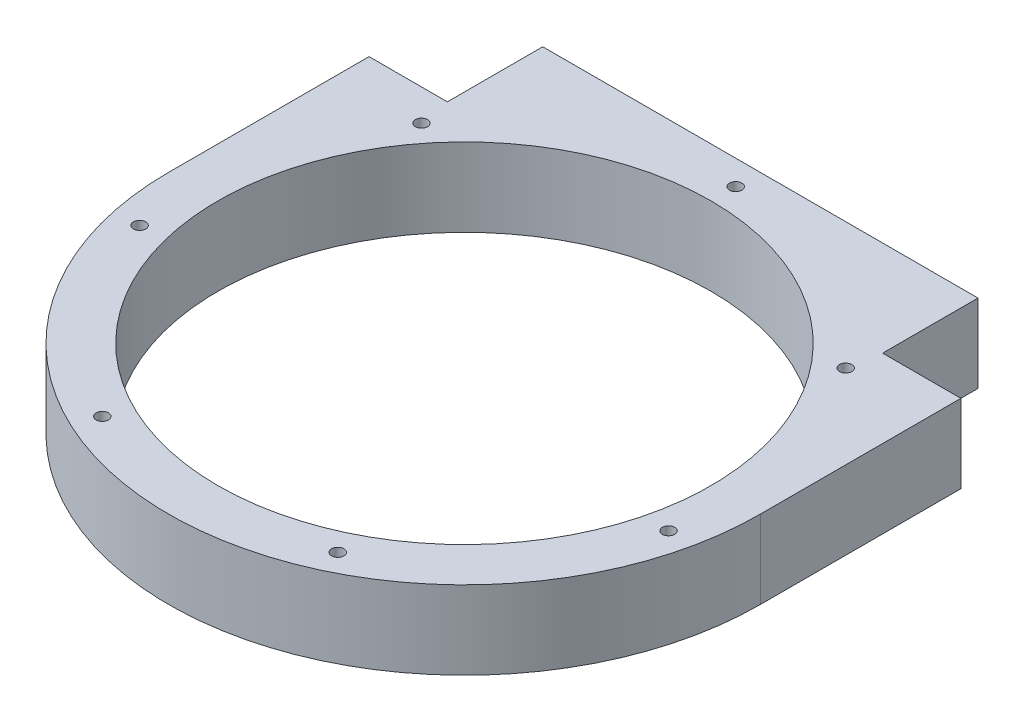
ISO-10303-21;
HEADER;
FILE_DESCRIPTION(('STEP AP214'),'2;1');
FILE_NAME('part.step','',(''),(''),'','','');
FILE_SCHEMA(('AUTOMOTIVE_DESIGN { 1 0 10303 214 1 1 1 1 }'));
ENDSEC;
DATA;
#1=APPLICATION_CONTEXT('core data for automotive mechanical design processes');
#2=APPLICATION_PROTOCOL_DEFINITION('international standard','automotive_design',2000,#1);
#3=PRODUCT_CONTEXT('',#1,'mechanical');
#4=PRODUCT('Part','Part','',(#3));
#5=PRODUCT_RELATED_PRODUCT_CATEGORY('part','',(#4));
#6=PRODUCT_DEFINITION_FORMATION('','',#4);
#7=PRODUCT_DEFINITION_CONTEXT('part definition',#1,'design');
#8=PRODUCT_DEFINITION('design','',#6,#7);
#9=PRODUCT_DEFINITION_SHAPE('','',#8);
#10=(LENGTH_UNIT() NAMED_UNIT(*) SI_UNIT(.MILLI.,.METRE.));
#11=(NAMED_UNIT(*) PLANE_ANGLE_UNIT() SI_UNIT($,.RADIAN.));
#12=(NAMED_UNIT(*) SI_UNIT($,.STERADIAN.) SOLID_ANGLE_UNIT());
#13=UNCERTAINTY_MEASURE_WITH_UNIT(LENGTH_MEASURE(1.E-05),#10,'distance_accuracy_value','');
#14=(GEOMETRIC_REPRESENTATION_CONTEXT(3) GLOBAL_UNCERTAINTY_ASSIGNED_CONTEXT((#13)) GLOBAL_UNIT_ASSIGNED_CONTEXT((#10,
#11,#12)) REPRESENTATION_CONTEXT('',''));
#15=CARTESIAN_POINT('',(0.,0.,0.));
#16=DIRECTION('',(0.,0.,1.));
#17=DIRECTION('',(1.,0.,0.));
#18=AXIS2_PLACEMENT_3D('',#15,#16,#17);
#19=CARTESIAN_POINT('',(0.,12.7,-48.));
#20=DIRECTION('',(0.,0.,1.));
#21=DIRECTION('',(1.,0.,0.));
#22=AXIS2_PLACEMENT_3D('',#19,#20,#21);
#23=PLANE('',#22);
#24=DIRECTION('',(-1.,0.,0.));
#25=VECTOR('',#24,1.);
#26=CARTESIAN_POINT('',(0.,0.,-48.));
#27=LINE('',#26,#25);
#28=CARTESIAN_POINT('',(35.3,0.,-48.));
#29=VERTEX_POINT('',#28);
#30=CARTESIAN_POINT('',(-35.3,0.,-48.));
#31=VERTEX_POINT('',#30);
#32=EDGE_CURVE('E161',#29,#31,#27,.T.);
#33=ORIENTED_EDGE('',*,*,#32,.T.);
#34=DIRECTION('',(0.,-1.,0.));
#35=VECTOR('',#34,1.);
#36=CARTESIAN_POINT('',(-35.3,12.7,-48.));
#37=LINE('',#36,#35);
#38=CARTESIAN_POINT('',(-35.3,12.7,-48.));
#39=VERTEX_POINT('',#38);
#40=EDGE_CURVE('E11',#39,#31,#37,.T.);
#41=ORIENTED_EDGE('',*,*,#40,.F.);
#42=DIRECTION('',(-1.,0.,0.));
#43=VECTOR('',#42,1.);
#44=CARTESIAN_POINT('',(0.,12.7,-48.));
#45=LINE('',#44,#43);
#46=CARTESIAN_POINT('',(35.3,12.7,-48.));
#47=VERTEX_POINT('',#46);
#48=EDGE_CURVE('E229',#47,#39,#45,.T.);
#49=ORIENTED_EDGE('',*,*,#48,.F.);
#50=DIRECTION('',(0.,-1.,0.));
#51=VECTOR('',#50,1.);
#52=CARTESIAN_POINT('',(35.3,12.7,-48.));
#53=LINE('',#52,#51);
#54=EDGE_CURVE('E157',#47,#29,#53,.T.);
#55=ORIENTED_EDGE('',*,*,#54,.T.);
#56=EDGE_LOOP('',(#33,#41,#49,#55));
#57=FACE_BOUND('',#56,.T.);
#58=ADVANCED_FACE('F39',(#57),#23,.F.);
#59=CARTESIAN_POINT('',(-35.3,12.7,0.));
#60=DIRECTION('',(1.,0.,0.));
#61=DIRECTION('',(0.,0.,-1.));
#62=AXIS2_PLACEMENT_3D('',#59,#60,#61);
#63=PLANE('',#62);
#64=DIRECTION('',(0.,0.,1.));
#65=VECTOR('',#64,1.);
#66=CARTESIAN_POINT('',(-35.3,0.,0.));
#67=LINE('',#66,#65);
#68=CARTESIAN_POINT('',(-35.3,0.,-32.525528435369));
#69=VERTEX_POINT('',#68);
#70=EDGE_CURVE('E164',#31,#69,#67,.T.);
#71=ORIENTED_EDGE('',*,*,#70,.T.);
#72=DIRECTION('',(0.,-1.,0.));
#73=VECTOR('',#72,1.);
#74=CARTESIAN_POINT('',(-35.3,12.7,-32.525528435369));
#75=LINE('',#74,#73);
#76=CARTESIAN_POINT('',(-35.3,12.7,-32.525528435369));
#77=VERTEX_POINT('',#76);
#78=EDGE_CURVE('E48',#77,#69,#75,.T.);
#79=ORIENTED_EDGE('',*,*,#78,.F.);
#80=DIRECTION('',(0.,0.,1.));
#81=VECTOR('',#80,1.);
#82=CARTESIAN_POINT('',(-35.3,12.7,0.));
#83=LINE('',#82,#81);
#84=EDGE_CURVE('E99',#39,#77,#83,.T.);
#85=ORIENTED_EDGE('',*,*,#84,.F.);
#86=ORIENTED_EDGE('',*,*,#40,.T.);
#87=EDGE_LOOP('',(#71,#79,#85,#86));
#88=FACE_BOUND('',#87,.T.);
#89=ADVANCED_FACE('F248',(#88),#63,.F.);
#90=CARTESIAN_POINT('',(0.,12.7,-32.5255284353691));
#91=DIRECTION('',(0.,0.,1.));
#92=DIRECTION('',(1.,0.,0.));
#93=AXIS2_PLACEMENT_3D('',#90,#91,#92);
#94=PLANE('',#93);
#95=DIRECTION('',(-1.,0.,0.));
#96=VECTOR('',#95,1.);
#97=CARTESIAN_POINT('',(0.,0.,-32.5255284353691));
#98=LINE('',#97,#96);
#99=CARTESIAN_POINT('',(-48.,0.,-32.525528435369));
#100=VERTEX_POINT('',#99);
#101=EDGE_CURVE('E166',#69,#100,#98,.T.);
#102=ORIENTED_EDGE('',*,*,#101,.T.);
#103=DIRECTION('',(0.,-1.,0.));
#104=VECTOR('',#103,1.);
#105=CARTESIAN_POINT('',(-48.,12.7,-32.525528435369));
#106=LINE('',#105,#104);
#107=CARTESIAN_POINT('',(-48.,12.7,-32.525528435369));
#108=VERTEX_POINT('',#107);
#109=EDGE_CURVE('E203',#108,#100,#106,.T.);
#110=ORIENTED_EDGE('',*,*,#109,.F.);
#111=DIRECTION('',(-1.,0.,0.));
#112=VECTOR('',#111,1.);
#113=CARTESIAN_POINT('',(0.,12.7,-32.5255284353691));
#114=LINE('',#113,#112);
#115=EDGE_CURVE('E211',#77,#108,#114,.T.);
#116=ORIENTED_EDGE('',*,*,#115,.F.);
#117=ORIENTED_EDGE('',*,*,#78,.T.);
#118=EDGE_LOOP('',(#102,#110,#116,#117));
#119=FACE_BOUND('',#118,.T.);
#120=ADVANCED_FACE('F209',(#119),#94,.F.);
#121=CARTESIAN_POINT('',(-48.,12.7,0.));
#122=DIRECTION('',(1.,0.,0.));
#123=DIRECTION('',(0.,0.,-1.));
#124=AXIS2_PLACEMENT_3D('',#121,#122,#123);
#125=PLANE('',#124);
#126=DIRECTION('',(0.,0.,1.));
#127=VECTOR('',#126,1.);
#128=CARTESIAN_POINT('',(-48.,0.,0.));
#129=LINE('',#128,#127);
#130=CARTESIAN_POINT('',(-48.,0.,0.));
#131=VERTEX_POINT('',#130);
#132=EDGE_CURVE('E168',#100,#131,#129,.T.);
#133=ORIENTED_EDGE('',*,*,#132,.T.);
#134=DIRECTION('',(0.,-1.,0.));
#135=VECTOR('',#134,1.);
#136=CARTESIAN_POINT('',(-48.,12.7,0.));
#137=LINE('',#136,#135);
#138=CARTESIAN_POINT('',(-48.,12.7,0.));
#139=VERTEX_POINT('',#138);
#140=EDGE_CURVE('E200',#139,#131,#137,.T.);
#141=ORIENTED_EDGE('',*,*,#140,.F.);
#142=DIRECTION('',(0.,0.,1.));
#143=VECTOR('',#142,1.);
#144=CARTESIAN_POINT('',(-48.,12.7,0.));
#145=LINE('',#144,#143);
#146=EDGE_CURVE('E224',#108,#139,#145,.T.);
#147=ORIENTED_EDGE('',*,*,#146,.F.);
#148=ORIENTED_EDGE('',*,*,#109,.T.);
#149=EDGE_LOOP('',(#133,#141,#147,#148));
#150=FACE_BOUND('',#149,.T.);
#151=ADVANCED_FACE('F220',(#150),#125,.F.);
#152=CARTESIAN_POINT('',(0.,12.7,0.));
#153=DIRECTION('',(0.,-1.,0.));
#154=DIRECTION('',(0.,0.,-1.));
#155=AXIS2_PLACEMENT_3D('',#152,#153,#154);
#156=CYLINDRICAL_SURFACE('',#155,48.);
#157=CARTESIAN_POINT('',(0.,0.,0.));
#158=DIRECTION('',(0.,1.,0.));
#159=DIRECTION('',(0.,0.,1.));
#160=AXIS2_PLACEMENT_3D('',#157,#158,#159);
#161=CIRCLE('',#160,48.);
#162=CARTESIAN_POINT('',(48.,0.,0.));
#163=VERTEX_POINT('',#162);
#164=EDGE_CURVE('E170',#131,#163,#161,.T.);
#165=ORIENTED_EDGE('',*,*,#164,.T.);
#166=DIRECTION('',(0.,-1.,0.));
#167=VECTOR('',#166,1.);
#168=CARTESIAN_POINT('',(48.,12.7,0.));
#169=LINE('',#168,#167);
#170=CARTESIAN_POINT('',(48.,12.7,0.));
#171=VERTEX_POINT('',#170);
#172=EDGE_CURVE('E128',#171,#163,#169,.T.);
#173=ORIENTED_EDGE('',*,*,#172,.F.);
#174=CARTESIAN_POINT('',(0.,12.7,0.));
#175=DIRECTION('',(0.,1.,0.));
#176=DIRECTION('',(0.,0.,1.));
#177=AXIS2_PLACEMENT_3D('',#174,#175,#176);
#178=CIRCLE('',#177,48.);
#179=EDGE_CURVE('E119',#139,#171,#178,.T.);
#180=ORIENTED_EDGE('',*,*,#179,.F.);
#181=ORIENTED_EDGE('',*,*,#140,.T.);
#182=EDGE_LOOP('',(#165,#173,#180,#181));
#183=FACE_BOUND('',#182,.T.);
#184=ADVANCED_FACE('F223',(#183),#156,.T.);
#185=CARTESIAN_POINT('',(48.,12.7,0.));
#186=DIRECTION('',(-1.,0.,0.));
#187=DIRECTION('',(0.,0.,1.));
#188=AXIS2_PLACEMENT_3D('',#185,#186,#187);
#189=PLANE('',#188);
#190=DIRECTION('',(0.,0.,-1.));
#191=VECTOR('',#190,1.);
#192=CARTESIAN_POINT('',(48.,0.,0.));
#193=LINE('',#192,#191);
#194=CARTESIAN_POINT('',(48.,0.,-32.525528435369));
#195=VERTEX_POINT('',#194);
#196=EDGE_CURVE('E127',#163,#195,#193,.T.);
#197=ORIENTED_EDGE('',*,*,#196,.T.);
#198=DIRECTION('',(0.,-1.,0.));
#199=VECTOR('',#198,1.);
#200=CARTESIAN_POINT('',(48.,12.7,-32.525528435369));
#201=LINE('',#200,#199);
#202=CARTESIAN_POINT('',(48.,12.7,-32.525528435369));
#203=VERTEX_POINT('',#202);
#204=EDGE_CURVE('E124',#203,#195,#201,.T.);
#205=ORIENTED_EDGE('',*,*,#204,.F.);
#206=DIRECTION('',(0.,0.,-1.));
#207=VECTOR('',#206,1.);
#208=CARTESIAN_POINT('',(48.,12.7,0.));
#209=LINE('',#208,#207);
#210=EDGE_CURVE('E112',#171,#203,#209,.T.);
#211=ORIENTED_EDGE('',*,*,#210,.F.);
#212=ORIENTED_EDGE('',*,*,#172,.T.);
#213=EDGE_LOOP('',(#197,#205,#211,#212));
#214=FACE_BOUND('',#213,.T.);
#215=ADVANCED_FACE('F125',(#214),#189,.F.);
#216=CARTESIAN_POINT('',(0.,12.7,-32.5255284353691));
#217=DIRECTION('',(0.,0.,1.));
#218=DIRECTION('',(1.,0.,0.));
#219=AXIS2_PLACEMENT_3D('',#216,#217,#218);
#220=PLANE('',#219);
#221=DIRECTION('',(-1.,0.,0.));
#222=VECTOR('',#221,1.);
#223=CARTESIAN_POINT('',(0.,0.,-32.5255284353691));
#224=LINE('',#223,#222);
#225=CARTESIAN_POINT('',(35.3,0.,-32.525528435369));
#226=VERTEX_POINT('',#225);
#227=EDGE_CURVE('E85',#195,#226,#224,.T.);
#228=ORIENTED_EDGE('',*,*,#227,.T.);
#229=DIRECTION('',(0.,-1.,0.));
#230=VECTOR('',#229,1.);
#231=CARTESIAN_POINT('',(35.3,12.7,-32.525528435369));
#232=LINE('',#231,#230);
#233=CARTESIAN_POINT('',(35.3,12.7,-32.525528435369));
#234=VERTEX_POINT('',#233);
#235=EDGE_CURVE('E129',#234,#226,#232,.T.);
#236=ORIENTED_EDGE('',*,*,#235,.F.);
#237=DIRECTION('',(-1.,0.,0.));
#238=VECTOR('',#237,1.);
#239=CARTESIAN_POINT('',(0.,12.7,-32.5255284353691));
#240=LINE('',#239,#238);
#241=EDGE_CURVE('E117',#203,#234,#240,.T.);
#242=ORIENTED_EDGE('',*,*,#241,.F.);
#243=ORIENTED_EDGE('',*,*,#204,.T.);
#244=EDGE_LOOP('',(#228,#236,#242,#243));
#245=FACE_BOUND('',#244,.T.);
#246=ADVANCED_FACE('F131',(#245),#220,.F.);
#247=CARTESIAN_POINT('',(19.0908845211726,12.7,39.6426301877064));
#248=DIRECTION('',(0.,-1.,0.));
#249=DIRECTION('',(0.,0.,-1.));
#250=AXIS2_PLACEMENT_3D('',#247,#248,#249);
#251=CYLINDRICAL_SURFACE('',#250,1.);
#252=CARTESIAN_POINT('',(19.0908845211726,12.7,39.6426301877064));
#253=DIRECTION('',(0.,1.,0.));
#254=DIRECTION('',(0.,0.,1.));
#255=AXIS2_PLACEMENT_3D('',#252,#253,#254);
#256=CIRCLE('',#255,1.);
#257=CARTESIAN_POINT('',(19.0908845211726,12.7,40.6426301877064));
#258=VERTEX_POINT('',#257);
#259=EDGE_CURVE('E151',#258,#258,#256,.T.);
#260=ORIENTED_EDGE('',*,*,#259,.T.);
#261=EDGE_LOOP('',(#260));
#262=FACE_BOUND('',#261,.T.);
#263=CARTESIAN_POINT('',(19.0908845211726,0.,39.6426301877064));
#264=DIRECTION('',(0.,1.,0.));
#265=DIRECTION('',(0.,0.,1.));
#266=AXIS2_PLACEMENT_3D('',#263,#264,#265);
#267=CIRCLE('',#266,1.);
#268=CARTESIAN_POINT('',(19.0908845211726,0.,40.6426301877064));
#269=VERTEX_POINT('',#268);
#270=EDGE_CURVE('E190',#269,#269,#267,.T.);
#271=ORIENTED_EDGE('',*,*,#270,.F.);
#272=EDGE_LOOP('',(#271));
#273=FACE_BOUND('',#272,.T.);
#274=ADVANCED_FACE('F265',(#262,#273),#251,.F.);
#275=CARTESIAN_POINT('',(-19.0908845211726,12.7,39.6426301877064));
#276=DIRECTION('',(0.,-1.,0.));
#277=DIRECTION('',(0.,0.,-1.));
#278=AXIS2_PLACEMENT_3D('',#275,#276,#277);
#279=CYLINDRICAL_SURFACE('',#278,1.);
#280=CARTESIAN_POINT('',(-19.0908845211726,12.7,39.6426301877064));
#281=DIRECTION('',(0.,1.,0.));
#282=DIRECTION('',(0.,0.,1.));
#283=AXIS2_PLACEMENT_3D('',#280,#281,#282);
#284=CIRCLE('',#283,1.);
#285=CARTESIAN_POINT('',(-19.0908845211726,12.7,40.6426301877064));
#286=VERTEX_POINT('',#285);
#287=EDGE_CURVE('E148',#286,#286,#284,.T.);
#288=ORIENTED_EDGE('',*,*,#287,.T.);
#289=EDGE_LOOP('',(#288));
#290=FACE_BOUND('',#289,.T.);
#291=CARTESIAN_POINT('',(-19.0908845211726,0.,39.6426301877064));
#292=DIRECTION('',(0.,1.,0.));
#293=DIRECTION('',(0.,0.,1.));
#294=AXIS2_PLACEMENT_3D('',#291,#292,#293);
#295=CIRCLE('',#294,1.);
#296=CARTESIAN_POINT('',(-19.0908845211726,0.,40.6426301877064));
#297=VERTEX_POINT('',#296);
#298=EDGE_CURVE('E187',#297,#297,#295,.T.);
#299=ORIENTED_EDGE('',*,*,#298,.F.);
#300=EDGE_LOOP('',(#299));
#301=FACE_BOUND('',#300,.T.);
#302=ADVANCED_FACE('F284',(#290,#301),#279,.F.);
#303=CARTESIAN_POINT('',(-42.8968281360002,12.7,9.79092109407784));
#304=DIRECTION('',(0.,-1.,0.));
#305=DIRECTION('',(0.,0.,-1.));
#306=AXIS2_PLACEMENT_3D('',#303,#304,#305);
#307=CYLINDRICAL_SURFACE('',#306,0.999999999999998);
#308=CARTESIAN_POINT('',(-42.8968281360002,12.7,9.79092109407784));
#309=DIRECTION('',(0.,1.,0.));
#310=DIRECTION('',(0.,0.,1.));
#311=AXIS2_PLACEMENT_3D('',#308,#309,#310);
#312=CIRCLE('',#311,0.999999999999998);
#313=CARTESIAN_POINT('',(-42.8968281360002,12.7,10.7909210940778));
#314=VERTEX_POINT('',#313);
#315=EDGE_CURVE('E145',#314,#314,#312,.T.);
#316=ORIENTED_EDGE('',*,*,#315,.T.);
#317=EDGE_LOOP('',(#316));
#318=FACE_BOUND('',#317,.T.);
#319=CARTESIAN_POINT('',(-42.8968281360002,0.,9.79092109407784));
#320=DIRECTION('',(0.,1.,0.));
#321=DIRECTION('',(0.,0.,1.));
#322=AXIS2_PLACEMENT_3D('',#319,#320,#321);
#323=CIRCLE('',#322,0.999999999999998);
#324=CARTESIAN_POINT('',(-42.8968281360002,0.,10.7909210940778));
#325=VERTEX_POINT('',#324);
#326=EDGE_CURVE('E184',#325,#325,#323,.T.);
#327=ORIENTED_EDGE('',*,*,#326,.F.);
#328=EDGE_LOOP('',(#327));
#329=FACE_BOUND('',#328,.T.);
#330=ADVANCED_FACE('F280',(#318,#329),#307,.F.);
#331=CARTESIAN_POINT('',(0.,12.7,-44.));
#332=DIRECTION('',(0.,-1.,0.));
#333=DIRECTION('',(0.,0.,-1.));
#334=AXIS2_PLACEMENT_3D('',#331,#332,#333);
#335=CYLINDRICAL_SURFACE('',#334,1.);
#336=CARTESIAN_POINT('',(0.,12.7,-44.));
#337=DIRECTION('',(0.,1.,0.));
#338=DIRECTION('',(0.,0.,1.));
#339=AXIS2_PLACEMENT_3D('',#336,#337,#338);
#340=CIRCLE('',#339,1.);
#341=CARTESIAN_POINT('',(0.,12.7,-43.));
#342=VERTEX_POINT('',#341);
#343=EDGE_CURVE('E142',#342,#342,#340,.T.);
#344=ORIENTED_EDGE('',*,*,#343,.T.);
#345=EDGE_LOOP('',(#344));
#346=FACE_BOUND('',#345,.T.);
#347=CARTESIAN_POINT('',(0.,0.,-44.));
#348=DIRECTION('',(0.,1.,0.));
#349=DIRECTION('',(0.,0.,1.));
#350=AXIS2_PLACEMENT_3D('',#347,#348,#349);
#351=CIRCLE('',#350,1.);
#352=CARTESIAN_POINT('',(0.,0.,-43.));
#353=VERTEX_POINT('',#352);
#354=EDGE_CURVE('E181',#353,#353,#351,.T.);
#355=ORIENTED_EDGE('',*,*,#354,.F.);
#356=EDGE_LOOP('',(#355));
#357=FACE_BOUND('',#356,.T.);
#358=ADVANCED_FACE('F276',(#346,#357),#335,.F.);
#359=CARTESIAN_POINT('',(34.4005852285933,12.7,-27.4335512817843));
#360=DIRECTION('',(0.,-1.,0.));
#361=DIRECTION('',(0.,0.,-1.));
#362=AXIS2_PLACEMENT_3D('',#359,#360,#361);
#363=CYLINDRICAL_SURFACE('',#362,0.999999999999998);
#364=CARTESIAN_POINT('',(34.4005852285933,12.7,-27.4335512817843));
#365=DIRECTION('',(0.,1.,0.));
#366=DIRECTION('',(0.,0.,1.));
#367=AXIS2_PLACEMENT_3D('',#364,#365,#366);
#368=CIRCLE('',#367,0.999999999999998);
#369=CARTESIAN_POINT('',(34.4005852285933,12.7,-26.4335512817843));
#370=VERTEX_POINT('',#369);
#371=EDGE_CURVE('E139',#370,#370,#368,.T.);
#372=ORIENTED_EDGE('',*,*,#371,.T.);
#373=EDGE_LOOP('',(#372));
#374=FACE_BOUND('',#373,.T.);
#375=CARTESIAN_POINT('',(34.4005852285933,0.,-27.4335512817843));
#376=DIRECTION('',(0.,1.,0.));
#377=DIRECTION('',(0.,0.,1.));
#378=AXIS2_PLACEMENT_3D('',#375,#376,#377);
#379=CIRCLE('',#378,0.999999999999998);
#380=CARTESIAN_POINT('',(34.4005852285933,0.,-26.4335512817843));
#381=VERTEX_POINT('',#380);
#382=EDGE_CURVE('E178',#381,#381,#379,.T.);
#383=ORIENTED_EDGE('',*,*,#382,.F.);
#384=EDGE_LOOP('',(#383));
#385=FACE_BOUND('',#384,.T.);
#386=ADVANCED_FACE('F272',(#374,#385),#363,.F.);
#387=CARTESIAN_POINT('',(-34.4005852285933,12.7,-27.4335512817843));
#388=DIRECTION('',(0.,-1.,0.));
#389=DIRECTION('',(0.,0.,-1.));
#390=AXIS2_PLACEMENT_3D('',#387,#388,#389);
#391=CYLINDRICAL_SURFACE('',#390,0.999999999999998);
#392=CARTESIAN_POINT('',(-34.4005852285933,12.7,-27.4335512817843));
#393=DIRECTION('',(0.,1.,0.));
#394=DIRECTION('',(0.,0.,1.));
#395=AXIS2_PLACEMENT_3D('',#392,#393,#394);
#396=CIRCLE('',#395,0.999999999999998);
#397=CARTESIAN_POINT('',(-34.4005852285933,12.7,-26.4335512817843));
#398=VERTEX_POINT('',#397);
#399=EDGE_CURVE('E133',#398,#398,#396,.T.);
#400=ORIENTED_EDGE('',*,*,#399,.T.);
#401=EDGE_LOOP('',(#400));
#402=FACE_BOUND('',#401,.T.);
#403=CARTESIAN_POINT('',(-34.4005852285933,0.,-27.4335512817843));
#404=DIRECTION('',(0.,1.,0.));
#405=DIRECTION('',(0.,0.,1.));
#406=AXIS2_PLACEMENT_3D('',#403,#404,#405);
#407=CIRCLE('',#406,0.999999999999998);
#408=CARTESIAN_POINT('',(-34.4005852285933,0.,-26.4335512817843));
#409=VERTEX_POINT('',#408);
#410=EDGE_CURVE('E175',#409,#409,#407,.T.);
#411=ORIENTED_EDGE('',*,*,#410,.F.);
#412=EDGE_LOOP('',(#411));
#413=FACE_BOUND('',#412,.T.);
#414=ADVANCED_FACE('F269',(#402,#413),#391,.F.);
#415=CARTESIAN_POINT('',(35.3,12.7,0.));
#416=DIRECTION('',(-1.,0.,0.));
#417=DIRECTION('',(0.,0.,1.));
#418=AXIS2_PLACEMENT_3D('',#415,#416,#417);
#419=PLANE('',#418);
#420=DIRECTION('',(0.,0.,-1.));
#421=VECTOR('',#420,1.);
#422=CARTESIAN_POINT('',(35.3,0.,0.));
#423=LINE('',#422,#421);
#424=EDGE_CURVE('E91',#226,#29,#423,.T.);
#425=ORIENTED_EDGE('',*,*,#424,.T.);
#426=ORIENTED_EDGE('',*,*,#54,.F.);
#427=DIRECTION('',(0.,0.,-1.));
#428=VECTOR('',#427,1.);
#429=CARTESIAN_POINT('',(35.3,12.7,0.));
#430=LINE('',#429,#428);
#431=EDGE_CURVE('E56',#234,#47,#430,.T.);
#432=ORIENTED_EDGE('',*,*,#431,.F.);
#433=ORIENTED_EDGE('',*,*,#235,.T.);
#434=EDGE_LOOP('',(#425,#426,#432,#433));
#435=FACE_BOUND('',#434,.T.);
#436=ADVANCED_FACE('F266',(#435),#419,.F.);
#437=CARTESIAN_POINT('',(0.,12.7,0.));
#438=DIRECTION('',(0.,-1.,0.));
#439=DIRECTION('',(0.,0.,-1.));
#440=AXIS2_PLACEMENT_3D('',#437,#438,#439);
#441=CYLINDRICAL_SURFACE('',#440,40.);
#442=CARTESIAN_POINT('',(0.,12.7,0.));
#443=DIRECTION('',(0.,1.,0.));
#444=DIRECTION('',(0.,0.,1.));
#445=AXIS2_PLACEMENT_3D('',#442,#443,#444);
#446=CIRCLE('',#445,40.);
#447=CARTESIAN_POINT('',(0.,12.7,40.));
#448=VERTEX_POINT('',#447);
#449=EDGE_CURVE('E196',#448,#448,#446,.T.);
#450=ORIENTED_EDGE('',*,*,#449,.T.);
#451=EDGE_LOOP('',(#450));
#452=FACE_BOUND('',#451,.T.);
#453=CARTESIAN_POINT('',(0.,0.,0.));
#454=DIRECTION('',(0.,1.,0.));
#455=DIRECTION('',(0.,0.,1.));
#456=AXIS2_PLACEMENT_3D('',#453,#454,#455);
#457=CIRCLE('',#456,40.);
#458=CARTESIAN_POINT('',(0.,0.,40.));
#459=VERTEX_POINT('',#458);
#460=EDGE_CURVE('E158',#459,#459,#457,.T.);
#461=ORIENTED_EDGE('',*,*,#460,.F.);
#462=EDGE_LOOP('',(#461));
#463=FACE_BOUND('',#462,.T.);
#464=ADVANCED_FACE('F41',(#452,#463),#441,.F.);
#465=CARTESIAN_POINT('',(42.8968281360002,12.7,9.79092109407783));
#466=DIRECTION('',(0.,-1.,0.));
#467=DIRECTION('',(0.,0.,-1.));
#468=AXIS2_PLACEMENT_3D('',#465,#466,#467);
#469=CYLINDRICAL_SURFACE('',#468,0.999999999999998);
#470=CARTESIAN_POINT('',(42.8968281360002,12.7,9.79092109407783));
#471=DIRECTION('',(0.,1.,0.));
#472=DIRECTION('',(0.,0.,1.));
#473=AXIS2_PLACEMENT_3D('',#470,#471,#472);
#474=CIRCLE('',#473,0.999999999999998);
#475=CARTESIAN_POINT('',(42.8968281360002,12.7,10.7909210940778));
#476=VERTEX_POINT('',#475);
#477=EDGE_CURVE('E154',#476,#476,#474,.T.);
#478=ORIENTED_EDGE('',*,*,#477,.T.);
#479=EDGE_LOOP('',(#478));
#480=FACE_BOUND('',#479,.T.);
#481=CARTESIAN_POINT('',(42.8968281360002,0.,9.79092109407783));
#482=DIRECTION('',(0.,1.,0.));
#483=DIRECTION('',(0.,0.,1.));
#484=AXIS2_PLACEMENT_3D('',#481,#482,#483);
#485=CIRCLE('',#484,0.999999999999998);
#486=CARTESIAN_POINT('',(42.8968281360002,0.,10.7909210940778));
#487=VERTEX_POINT('',#486);
#488=EDGE_CURVE('E193',#487,#487,#485,.T.);
#489=ORIENTED_EDGE('',*,*,#488,.F.);
#490=EDGE_LOOP('',(#489));
#491=FACE_BOUND('',#490,.T.);
#492=ADVANCED_FACE('F237',(#480,#491),#469,.F.);
#493=CARTESIAN_POINT('',(0.,12.7,0.));
#494=DIRECTION('',(0.,1.,0.));
#495=DIRECTION('',(0.,0.,1.));
#496=AXIS2_PLACEMENT_3D('',#493,#494,#495);
#497=PLANE('',#496);
#498=ORIENTED_EDGE('',*,*,#449,.F.);
#499=EDGE_LOOP('',(#498));
#500=FACE_BOUND('',#499,.T.);
#501=ORIENTED_EDGE('',*,*,#48,.T.);
#502=ORIENTED_EDGE('',*,*,#84,.T.);
#503=ORIENTED_EDGE('',*,*,#115,.T.);
#504=ORIENTED_EDGE('',*,*,#146,.T.);
#505=ORIENTED_EDGE('',*,*,#179,.T.);
#506=ORIENTED_EDGE('',*,*,#210,.T.);
#507=ORIENTED_EDGE('',*,*,#241,.T.);
#508=ORIENTED_EDGE('',*,*,#431,.T.);
#509=EDGE_LOOP('',(#501,#502,#503,#504,#505,#506,#507,#508));
#510=FACE_BOUND('',#509,.T.);
#511=ORIENTED_EDGE('',*,*,#399,.F.);
#512=EDGE_LOOP('',(#511));
#513=FACE_BOUND('',#512,.T.);
#514=ORIENTED_EDGE('',*,*,#371,.F.);
#515=EDGE_LOOP('',(#514));
#516=FACE_BOUND('',#515,.T.);
#517=ORIENTED_EDGE('',*,*,#343,.F.);
#518=EDGE_LOOP('',(#517));
#519=FACE_BOUND('',#518,.T.);
#520=ORIENTED_EDGE('',*,*,#315,.F.);
#521=EDGE_LOOP('',(#520));
#522=FACE_BOUND('',#521,.T.);
#523=ORIENTED_EDGE('',*,*,#287,.F.);
#524=EDGE_LOOP('',(#523));
#525=FACE_BOUND('',#524,.T.);
#526=ORIENTED_EDGE('',*,*,#259,.F.);
#527=EDGE_LOOP('',(#526));
#528=FACE_BOUND('',#527,.T.);
#529=ORIENTED_EDGE('',*,*,#477,.F.);
#530=EDGE_LOOP('',(#529));
#531=FACE_BOUND('',#530,.T.);
#532=ADVANCED_FACE('F114',(#500,#510,#513,#516,#519,#522,#525,#528,#531),#497,.T.);
#533=CARTESIAN_POINT('',(0.,0.,0.));
#534=DIRECTION('',(0.,1.,0.));
#535=DIRECTION('',(0.,0.,1.));
#536=AXIS2_PLACEMENT_3D('',#533,#534,#535);
#537=PLANE('',#536);
#538=ORIENTED_EDGE('',*,*,#460,.T.);
#539=EDGE_LOOP('',(#538));
#540=FACE_BOUND('',#539,.T.);
#541=ORIENTED_EDGE('',*,*,#32,.F.);
#542=ORIENTED_EDGE('',*,*,#424,.F.);
#543=ORIENTED_EDGE('',*,*,#227,.F.);
#544=ORIENTED_EDGE('',*,*,#196,.F.);
#545=ORIENTED_EDGE('',*,*,#164,.F.);
#546=ORIENTED_EDGE('',*,*,#132,.F.);
#547=ORIENTED_EDGE('',*,*,#101,.F.);
#548=ORIENTED_EDGE('',*,*,#70,.F.);
#549=EDGE_LOOP('',(#541,#542,#543,#544,#545,#546,#547,#548));
#550=FACE_BOUND('',#549,.T.);
#551=ORIENTED_EDGE('',*,*,#410,.T.);
#552=EDGE_LOOP('',(#551));
#553=FACE_BOUND('',#552,.T.);
#554=ORIENTED_EDGE('',*,*,#382,.T.);
#555=EDGE_LOOP('',(#554));
#556=FACE_BOUND('',#555,.T.);
#557=ORIENTED_EDGE('',*,*,#354,.T.);
#558=EDGE_LOOP('',(#557));
#559=FACE_BOUND('',#558,.T.);
#560=ORIENTED_EDGE('',*,*,#326,.T.);
#561=EDGE_LOOP('',(#560));
#562=FACE_BOUND('',#561,.T.);
#563=ORIENTED_EDGE('',*,*,#298,.T.);
#564=EDGE_LOOP('',(#563));
#565=FACE_BOUND('',#564,.T.);
#566=ORIENTED_EDGE('',*,*,#270,.T.);
#567=EDGE_LOOP('',(#566));
#568=FACE_BOUND('',#567,.T.);
#569=ORIENTED_EDGE('',*,*,#488,.T.);
#570=EDGE_LOOP('',(#569));
#571=FACE_BOUND('',#570,.T.);
#572=ADVANCED_FACE('F215',(#540,#550,#553,#556,#559,#562,#565,#568,#571),#537,.F.);
#573=CLOSED_SHELL('',(#58,#89,#120,#151,#184,#215,#246,#274,#302,#330,#358,#386,#414,#436,#464,
#492,#532,#572));
#574=MANIFOLD_SOLID_BREP('B2',#573);
#575=ADVANCED_BREP_SHAPE_REPRESENTATION('',(#18,#574),#14);
#576=SHAPE_DEFINITION_REPRESENTATION(#9,#575);
ENDSEC;
END-ISO-10303-21;
